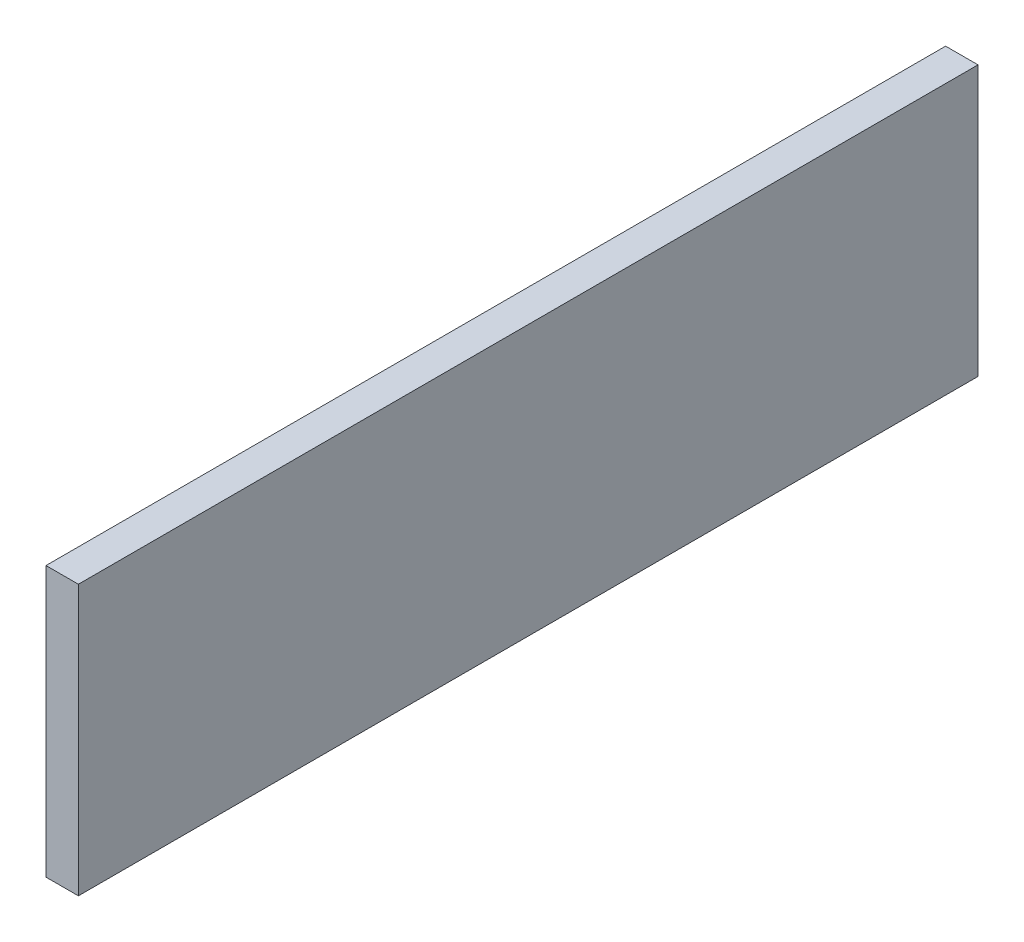
ISO-10303-21;
HEADER;
FILE_DESCRIPTION(('STEP AP214'),'2;1');
FILE_NAME('part.step','',(''),(''),'','','');
FILE_SCHEMA(('AUTOMOTIVE_DESIGN { 1 0 10303 214 1 1 1 1 }'));
ENDSEC;
DATA;
#1=APPLICATION_CONTEXT('core data for automotive mechanical design processes');
#2=APPLICATION_PROTOCOL_DEFINITION('international standard','automotive_design',2000,#1);
#3=PRODUCT_CONTEXT('',#1,'mechanical');
#4=PRODUCT('Part','Part','',(#3));
#5=PRODUCT_RELATED_PRODUCT_CATEGORY('part','',(#4));
#6=PRODUCT_DEFINITION_FORMATION('','',#4);
#7=PRODUCT_DEFINITION_CONTEXT('part definition',#1,'design');
#8=PRODUCT_DEFINITION('design','',#6,#7);
#9=PRODUCT_DEFINITION_SHAPE('','',#8);
#10=(LENGTH_UNIT() NAMED_UNIT(*) SI_UNIT(.MILLI.,.METRE.));
#11=(NAMED_UNIT(*) PLANE_ANGLE_UNIT() SI_UNIT($,.RADIAN.));
#12=(NAMED_UNIT(*) SI_UNIT($,.STERADIAN.) SOLID_ANGLE_UNIT());
#13=UNCERTAINTY_MEASURE_WITH_UNIT(LENGTH_MEASURE(1.E-05),#10,'distance_accuracy_value','');
#14=(GEOMETRIC_REPRESENTATION_CONTEXT(3) GLOBAL_UNCERTAINTY_ASSIGNED_CONTEXT((#13)) GLOBAL_UNIT_ASSIGNED_CONTEXT((#10,
#11,#12)) REPRESENTATION_CONTEXT('',''));
#15=CARTESIAN_POINT('',(0.,0.,0.));
#16=DIRECTION('',(0.,0.,1.));
#17=DIRECTION('',(1.,0.,0.));
#18=AXIS2_PLACEMENT_3D('',#15,#16,#17);
#19=CARTESIAN_POINT('',(18.,0.,0.));
#20=DIRECTION('',(0.,0.,-1.));
#21=DIRECTION('',(-1.,0.,0.));
#22=AXIS2_PLACEMENT_3D('',#19,#20,#21);
#23=PLANE('',#22);
#24=DIRECTION('',(0.,-1.,0.));
#25=VECTOR('',#24,1.);
#26=CARTESIAN_POINT('',(0.,0.,0.));
#27=LINE('',#26,#25);
#28=CARTESIAN_POINT('',(0.,150.,0.));
#29=VERTEX_POINT('',#28);
#30=CARTESIAN_POINT('',(0.,0.,0.));
#31=VERTEX_POINT('',#30);
#32=EDGE_CURVE('E96',#29,#31,#27,.T.);
#33=ORIENTED_EDGE('',*,*,#32,.T.);
#34=DIRECTION('',(-1.,0.,0.));
#35=VECTOR('',#34,1.);
#36=CARTESIAN_POINT('',(18.,0.,0.));
#37=LINE('',#36,#35);
#38=CARTESIAN_POINT('',(18.,0.,0.));
#39=VERTEX_POINT('',#38);
#40=EDGE_CURVE('E11',#39,#31,#37,.T.);
#41=ORIENTED_EDGE('',*,*,#40,.F.);
#42=DIRECTION('',(0.,-1.,0.));
#43=VECTOR('',#42,1.);
#44=CARTESIAN_POINT('',(18.,0.,0.));
#45=LINE('',#44,#43);
#46=CARTESIAN_POINT('',(18.,150.,0.));
#47=VERTEX_POINT('',#46);
#48=EDGE_CURVE('E84',#47,#39,#45,.T.);
#49=ORIENTED_EDGE('',*,*,#48,.F.);
#50=DIRECTION('',(-1.,0.,0.));
#51=VECTOR('',#50,1.);
#52=CARTESIAN_POINT('',(18.,150.,0.));
#53=LINE('',#52,#51);
#54=EDGE_CURVE('E92',#47,#29,#53,.T.);
#55=ORIENTED_EDGE('',*,*,#54,.T.);
#56=EDGE_LOOP('',(#33,#41,#49,#55));
#57=FACE_BOUND('',#56,.T.);
#58=ADVANCED_FACE('F33',(#57),#23,.F.);
#59=CARTESIAN_POINT('',(18.,0.,0.));
#60=DIRECTION('',(0.,1.,0.));
#61=DIRECTION('',(0.,0.,1.));
#62=AXIS2_PLACEMENT_3D('',#59,#60,#61);
#63=PLANE('',#62);
#64=DIRECTION('',(0.,0.,-1.));
#65=VECTOR('',#64,1.);
#66=CARTESIAN_POINT('',(0.,0.,0.));
#67=LINE('',#66,#65);
#68=CARTESIAN_POINT('',(0.,0.,-500.));
#69=VERTEX_POINT('',#68);
#70=EDGE_CURVE('E88',#31,#69,#67,.T.);
#71=ORIENTED_EDGE('',*,*,#70,.T.);
#72=DIRECTION('',(-1.,0.,0.));
#73=VECTOR('',#72,1.);
#74=CARTESIAN_POINT('',(18.,0.,-500.));
#75=LINE('',#74,#73);
#76=CARTESIAN_POINT('',(18.,0.,-500.));
#77=VERTEX_POINT('',#76);
#78=EDGE_CURVE('E41',#77,#69,#75,.T.);
#79=ORIENTED_EDGE('',*,*,#78,.F.);
#80=DIRECTION('',(0.,0.,-1.));
#81=VECTOR('',#80,1.);
#82=CARTESIAN_POINT('',(18.,0.,0.));
#83=LINE('',#82,#81);
#84=EDGE_CURVE('E79',#39,#77,#83,.T.);
#85=ORIENTED_EDGE('',*,*,#84,.F.);
#86=ORIENTED_EDGE('',*,*,#40,.T.);
#87=EDGE_LOOP('',(#71,#79,#85,#86));
#88=FACE_BOUND('',#87,.T.);
#89=ADVANCED_FACE('F87',(#88),#63,.F.);
#90=CARTESIAN_POINT('',(18.,0.,-500.));
#91=DIRECTION('',(0.,0.,1.));
#92=DIRECTION('',(1.,0.,0.));
#93=AXIS2_PLACEMENT_3D('',#90,#91,#92);
#94=PLANE('',#93);
#95=DIRECTION('',(0.,1.,0.));
#96=VECTOR('',#95,1.);
#97=CARTESIAN_POINT('',(0.,0.,-500.));
#98=LINE('',#97,#96);
#99=CARTESIAN_POINT('',(0.,150.,-500.));
#100=VERTEX_POINT('',#99);
#101=EDGE_CURVE('E66',#69,#100,#98,.T.);
#102=ORIENTED_EDGE('',*,*,#101,.T.);
#103=DIRECTION('',(-1.,0.,0.));
#104=VECTOR('',#103,1.);
#105=CARTESIAN_POINT('',(18.,150.,-500.));
#106=LINE('',#105,#104);
#107=CARTESIAN_POINT('',(18.,150.,-500.));
#108=VERTEX_POINT('',#107);
#109=EDGE_CURVE('E89',#108,#100,#106,.T.);
#110=ORIENTED_EDGE('',*,*,#109,.F.);
#111=DIRECTION('',(0.,1.,0.));
#112=VECTOR('',#111,1.);
#113=CARTESIAN_POINT('',(18.,0.,-500.));
#114=LINE('',#113,#112);
#115=EDGE_CURVE('E82',#77,#108,#114,.T.);
#116=ORIENTED_EDGE('',*,*,#115,.F.);
#117=ORIENTED_EDGE('',*,*,#78,.T.);
#118=EDGE_LOOP('',(#102,#110,#116,#117));
#119=FACE_BOUND('',#118,.T.);
#120=ADVANCED_FACE('F90',(#119),#94,.F.);
#121=CARTESIAN_POINT('',(18.,150.,0.));
#122=DIRECTION('',(0.,-1.,0.));
#123=DIRECTION('',(0.,0.,-1.));
#124=AXIS2_PLACEMENT_3D('',#121,#122,#123);
#125=PLANE('',#124);
#126=DIRECTION('',(0.,0.,1.));
#127=VECTOR('',#126,1.);
#128=CARTESIAN_POINT('',(0.,150.,0.));
#129=LINE('',#128,#127);
#130=EDGE_CURVE('E72',#100,#29,#129,.T.);
#131=ORIENTED_EDGE('',*,*,#130,.T.);
#132=ORIENTED_EDGE('',*,*,#54,.F.);
#133=DIRECTION('',(0.,0.,1.));
#134=VECTOR('',#133,1.);
#135=CARTESIAN_POINT('',(18.,150.,0.));
#136=LINE('',#135,#134);
#137=EDGE_CURVE('E49',#108,#47,#136,.T.);
#138=ORIENTED_EDGE('',*,*,#137,.F.);
#139=ORIENTED_EDGE('',*,*,#109,.T.);
#140=EDGE_LOOP('',(#131,#132,#138,#139));
#141=FACE_BOUND('',#140,.T.);
#142=ADVANCED_FACE('F103',(#141),#125,.F.);
#143=CARTESIAN_POINT('',(18.,0.,0.));
#144=DIRECTION('',(-1.,0.,0.));
#145=DIRECTION('',(0.,0.,1.));
#146=AXIS2_PLACEMENT_3D('',#143,#144,#145);
#147=PLANE('',#146);
#148=ORIENTED_EDGE('',*,*,#48,.T.);
#149=ORIENTED_EDGE('',*,*,#84,.T.);
#150=ORIENTED_EDGE('',*,*,#115,.T.);
#151=ORIENTED_EDGE('',*,*,#137,.T.);
#152=EDGE_LOOP('',(#148,#149,#150,#151));
#153=FACE_BOUND('',#152,.T.);
#154=ADVANCED_FACE('F80',(#153),#147,.F.);
#155=CARTESIAN_POINT('',(0.,0.,0.));
#156=DIRECTION('',(-1.,0.,0.));
#157=DIRECTION('',(0.,0.,1.));
#158=AXIS2_PLACEMENT_3D('',#155,#156,#157);
#159=PLANE('',#158);
#160=ORIENTED_EDGE('',*,*,#32,.F.);
#161=ORIENTED_EDGE('',*,*,#130,.F.);
#162=ORIENTED_EDGE('',*,*,#101,.F.);
#163=ORIENTED_EDGE('',*,*,#70,.F.);
#164=EDGE_LOOP('',(#160,#161,#162,#163));
#165=FACE_BOUND('',#164,.T.);
#166=ADVANCED_FACE('F106',(#165),#159,.T.);
#167=CLOSED_SHELL('',(#58,#89,#120,#142,#154,#166));
#168=MANIFOLD_SOLID_BREP('B2',#167);
#169=ADVANCED_BREP_SHAPE_REPRESENTATION('',(#18,#168),#14);
#170=SHAPE_DEFINITION_REPRESENTATION(#9,#169);
ENDSEC;
END-ISO-10303-21;
